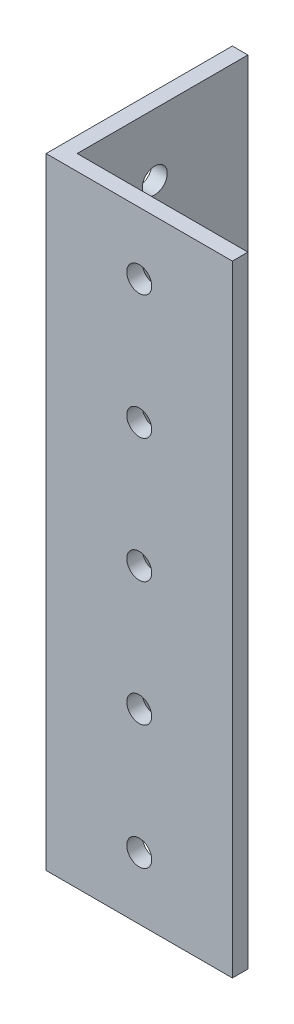
ISO-10303-21;
HEADER;
FILE_DESCRIPTION(('STEP AP214'),'2;1');
FILE_NAME('part.step','',(''),(''),'','','');
FILE_SCHEMA(('AUTOMOTIVE_DESIGN { 1 0 10303 214 1 1 1 1 }'));
ENDSEC;
DATA;
#1=APPLICATION_CONTEXT('core data for automotive mechanical design processes');
#2=APPLICATION_PROTOCOL_DEFINITION('international standard','automotive_design',2000,#1);
#3=PRODUCT_CONTEXT('',#1,'mechanical');
#4=PRODUCT('Part','Part','',(#3));
#5=PRODUCT_RELATED_PRODUCT_CATEGORY('part','',(#4));
#6=PRODUCT_DEFINITION_FORMATION('','',#4);
#7=PRODUCT_DEFINITION_CONTEXT('part definition',#1,'design');
#8=PRODUCT_DEFINITION('design','',#6,#7);
#9=PRODUCT_DEFINITION_SHAPE('','',#8);
#10=(LENGTH_UNIT() NAMED_UNIT(*) SI_UNIT(.MILLI.,.METRE.));
#11=(NAMED_UNIT(*) PLANE_ANGLE_UNIT() SI_UNIT($,.RADIAN.));
#12=(NAMED_UNIT(*) SI_UNIT($,.STERADIAN.) SOLID_ANGLE_UNIT());
#13=UNCERTAINTY_MEASURE_WITH_UNIT(LENGTH_MEASURE(1.E-05),#10,'distance_accuracy_value','');
#14=(GEOMETRIC_REPRESENTATION_CONTEXT(3) GLOBAL_UNCERTAINTY_ASSIGNED_CONTEXT((#13)) GLOBAL_UNIT_ASSIGNED_CONTEXT((#10,
#11,#12)) REPRESENTATION_CONTEXT('',''));
#15=CARTESIAN_POINT('',(0.,0.,0.));
#16=DIRECTION('',(0.,0.,1.));
#17=DIRECTION('',(1.,0.,0.));
#18=AXIS2_PLACEMENT_3D('',#15,#16,#17);
#19=CARTESIAN_POINT('',(0.,127.,-2.67982574257426));
#20=DIRECTION('',(0.,0.,-1.));
#21=DIRECTION('',(-1.,0.,0.));
#22=AXIS2_PLACEMENT_3D('',#19,#20,#21);
#23=PLANE('',#22);
#24=CARTESIAN_POINT('',(-14.2697702970297,114.3,-2.67982574257426));
#25=DIRECTION('',(0.,0.,-1.));
#26=DIRECTION('',(-1.,0.,0.));
#27=AXIS2_PLACEMENT_3D('',#24,#25,#26);
#28=CIRCLE('',#27,2.5527);
#29=CARTESIAN_POINT('',(-16.8224702970297,114.3,-2.67982574257426));
#30=VERTEX_POINT('',#29);
#31=EDGE_CURVE('E205',#30,#30,#28,.T.);
#32=ORIENTED_EDGE('',*,*,#31,.F.);
#33=EDGE_LOOP('',(#32));
#34=FACE_BOUND('',#33,.T.);
#35=CARTESIAN_POINT('',(-14.2697702970297,88.9,-2.67982574257426));
#36=DIRECTION('',(0.,0.,-1.));
#37=DIRECTION('',(-1.,0.,0.));
#38=AXIS2_PLACEMENT_3D('',#35,#36,#37);
#39=CIRCLE('',#38,2.5527);
#40=CARTESIAN_POINT('',(-16.8224702970297,88.9,-2.67982574257426));
#41=VERTEX_POINT('',#40);
#42=EDGE_CURVE('E199',#41,#41,#39,.T.);
#43=ORIENTED_EDGE('',*,*,#42,.F.);
#44=EDGE_LOOP('',(#43));
#45=FACE_BOUND('',#44,.T.);
#46=CARTESIAN_POINT('',(-14.2697702970297,63.5,-2.67982574257426));
#47=DIRECTION('',(0.,0.,-1.));
#48=DIRECTION('',(-1.,0.,0.));
#49=AXIS2_PLACEMENT_3D('',#46,#47,#48);
#50=CIRCLE('',#49,2.5527);
#51=CARTESIAN_POINT('',(-16.8224702970297,63.5,-2.67982574257426));
#52=VERTEX_POINT('',#51);
#53=EDGE_CURVE('E193',#52,#52,#50,.T.);
#54=ORIENTED_EDGE('',*,*,#53,.F.);
#55=EDGE_LOOP('',(#54));
#56=FACE_BOUND('',#55,.T.);
#57=CARTESIAN_POINT('',(-14.2697702970297,38.1,-2.67982574257426));
#58=DIRECTION('',(0.,0.,-1.));
#59=DIRECTION('',(-1.,0.,0.));
#60=AXIS2_PLACEMENT_3D('',#57,#58,#59);
#61=CIRCLE('',#60,2.5527);
#62=CARTESIAN_POINT('',(-16.8224702970297,38.1,-2.67982574257426));
#63=VERTEX_POINT('',#62);
#64=EDGE_CURVE('E185',#63,#63,#61,.T.);
#65=ORIENTED_EDGE('',*,*,#64,.F.);
#66=EDGE_LOOP('',(#65));
#67=FACE_BOUND('',#66,.T.);
#68=CARTESIAN_POINT('',(-14.2697702970297,12.7,-2.67982574257426));
#69=DIRECTION('',(0.,0.,-1.));
#70=DIRECTION('',(-1.,0.,0.));
#71=AXIS2_PLACEMENT_3D('',#68,#69,#70);
#72=CIRCLE('',#71,2.5527);
#73=CARTESIAN_POINT('',(-16.8224702970297,12.7,-2.67982574257426));
#74=VERTEX_POINT('',#73);
#75=EDGE_CURVE('E182',#74,#74,#72,.T.);
#76=ORIENTED_EDGE('',*,*,#75,.F.);
#77=EDGE_LOOP('',(#76));
#78=FACE_BOUND('',#77,.T.);
#79=DIRECTION('',(1.,0.,0.));
#80=VECTOR('',#79,1.);
#81=CARTESIAN_POINT('',(0.,0.,-2.67982574257426));
#82=LINE('',#81,#80);
#83=CARTESIAN_POINT('',(-30.1447702970297,0.,-2.67982574257426));
#84=VERTEX_POINT('',#83);
#85=CARTESIAN_POINT('',(4.7802297029703,0.,-2.67982574257426));
#86=VERTEX_POINT('',#85);
#87=EDGE_CURVE('E121',#84,#86,#82,.T.);
#88=ORIENTED_EDGE('',*,*,#87,.F.);
#89=DIRECTION('',(0.,-1.,0.));
#90=VECTOR('',#89,1.);
#91=CARTESIAN_POINT('',(-30.1447702970297,127.,-2.67982574257426));
#92=LINE('',#91,#90);
#93=CARTESIAN_POINT('',(-30.1447702970297,127.,-2.67982574257426));
#94=VERTEX_POINT('',#93);
#95=EDGE_CURVE('E11',#94,#84,#92,.T.);
#96=ORIENTED_EDGE('',*,*,#95,.F.);
#97=DIRECTION('',(1.,0.,0.));
#98=VECTOR('',#97,1.);
#99=CARTESIAN_POINT('',(0.,127.,-2.67982574257426));
#100=LINE('',#99,#98);
#101=CARTESIAN_POINT('',(4.7802297029703,127.,-2.67982574257426));
#102=VERTEX_POINT('',#101);
#103=EDGE_CURVE('E135',#94,#102,#100,.T.);
#104=ORIENTED_EDGE('',*,*,#103,.T.);
#105=DIRECTION('',(0.,-1.,0.));
#106=VECTOR('',#105,1.);
#107=CARTESIAN_POINT('',(4.7802297029703,127.,-2.67982574257426));
#108=LINE('',#107,#106);
#109=EDGE_CURVE('E83',#102,#86,#108,.T.);
#110=ORIENTED_EDGE('',*,*,#109,.T.);
#111=EDGE_LOOP('',(#88,#96,#104,#110));
#112=FACE_BOUND('',#111,.T.);
#113=ADVANCED_FACE('F39',(#34,#45,#56,#67,#78,#112),#23,.T.);
#114=CARTESIAN_POINT('',(-30.1447702970297,127.,0.));
#115=DIRECTION('',(-1.,0.,0.));
#116=DIRECTION('',(0.,0.,1.));
#117=AXIS2_PLACEMENT_3D('',#114,#115,#116);
#118=PLANE('',#117);
#119=CARTESIAN_POINT('',(-30.1447702970297,114.3,-18.5548257425743));
#120=DIRECTION('',(1.,0.,0.));
#121=DIRECTION('',(0.,0.,-1.));
#122=AXIS2_PLACEMENT_3D('',#119,#120,#121);
#123=CIRCLE('',#122,2.5527);
#124=CARTESIAN_POINT('',(-30.1447702970297,114.3,-21.1075257425743));
#125=VERTEX_POINT('',#124);
#126=EDGE_CURVE('E175',#125,#125,#123,.T.);
#127=ORIENTED_EDGE('',*,*,#126,.F.);
#128=EDGE_LOOP('',(#127));
#129=FACE_BOUND('',#128,.T.);
#130=CARTESIAN_POINT('',(-30.1447702970297,88.9,-18.5548257425743));
#131=DIRECTION('',(1.,0.,0.));
#132=DIRECTION('',(0.,0.,-1.));
#133=AXIS2_PLACEMENT_3D('',#130,#131,#132);
#134=CIRCLE('',#133,2.5527);
#135=CARTESIAN_POINT('',(-30.1447702970297,88.9,-21.1075257425743));
#136=VERTEX_POINT('',#135);
#137=EDGE_CURVE('E169',#136,#136,#134,.T.);
#138=ORIENTED_EDGE('',*,*,#137,.F.);
#139=EDGE_LOOP('',(#138));
#140=FACE_BOUND('',#139,.T.);
#141=CARTESIAN_POINT('',(-30.1447702970297,63.5,-18.5548257425743));
#142=DIRECTION('',(1.,0.,0.));
#143=DIRECTION('',(0.,0.,-1.));
#144=AXIS2_PLACEMENT_3D('',#141,#142,#143);
#145=CIRCLE('',#144,2.5527);
#146=CARTESIAN_POINT('',(-30.1447702970297,63.5,-21.1075257425743));
#147=VERTEX_POINT('',#146);
#148=EDGE_CURVE('E163',#147,#147,#145,.T.);
#149=ORIENTED_EDGE('',*,*,#148,.F.);
#150=EDGE_LOOP('',(#149));
#151=FACE_BOUND('',#150,.T.);
#152=CARTESIAN_POINT('',(-30.1447702970297,38.1,-18.5548257425743));
#153=DIRECTION('',(1.,0.,0.));
#154=DIRECTION('',(0.,0.,-1.));
#155=AXIS2_PLACEMENT_3D('',#152,#153,#154);
#156=CIRCLE('',#155,2.5527);
#157=CARTESIAN_POINT('',(-30.1447702970297,38.1,-21.1075257425743));
#158=VERTEX_POINT('',#157);
#159=EDGE_CURVE('E155',#158,#158,#156,.T.);
#160=ORIENTED_EDGE('',*,*,#159,.F.);
#161=EDGE_LOOP('',(#160));
#162=FACE_BOUND('',#161,.T.);
#163=CARTESIAN_POINT('',(-30.1447702970297,12.7,-18.5548257425743));
#164=DIRECTION('',(1.,0.,0.));
#165=DIRECTION('',(0.,0.,-1.));
#166=AXIS2_PLACEMENT_3D('',#163,#164,#165);
#167=CIRCLE('',#166,2.5527);
#168=CARTESIAN_POINT('',(-30.1447702970297,12.7,-21.1075257425743));
#169=VERTEX_POINT('',#168);
#170=EDGE_CURVE('E152',#169,#169,#167,.T.);
#171=ORIENTED_EDGE('',*,*,#170,.F.);
#172=EDGE_LOOP('',(#171));
#173=FACE_BOUND('',#172,.T.);
#174=DIRECTION('',(0.,0.,-1.));
#175=VECTOR('',#174,1.);
#176=CARTESIAN_POINT('',(-30.1447702970297,0.,0.));
#177=LINE('',#176,#175);
#178=CARTESIAN_POINT('',(-30.1447702970297,0.,-37.6048257425743));
#179=VERTEX_POINT('',#178);
#180=EDGE_CURVE('E124',#84,#179,#177,.T.);
#181=ORIENTED_EDGE('',*,*,#180,.T.);
#182=DIRECTION('',(0.,-1.,0.));
#183=VECTOR('',#182,1.);
#184=CARTESIAN_POINT('',(-30.1447702970297,127.,-37.6048257425743));
#185=LINE('',#184,#183);
#186=CARTESIAN_POINT('',(-30.1447702970297,127.,-37.6048257425743));
#187=VERTEX_POINT('',#186);
#188=EDGE_CURVE('E47',#187,#179,#185,.T.);
#189=ORIENTED_EDGE('',*,*,#188,.F.);
#190=DIRECTION('',(0.,0.,-1.));
#191=VECTOR('',#190,1.);
#192=CARTESIAN_POINT('',(-30.1447702970297,127.,0.));
#193=LINE('',#192,#191);
#194=EDGE_CURVE('E116',#94,#187,#193,.T.);
#195=ORIENTED_EDGE('',*,*,#194,.F.);
#196=ORIENTED_EDGE('',*,*,#95,.T.);
#197=EDGE_LOOP('',(#181,#189,#195,#196));
#198=FACE_BOUND('',#197,.T.);
#199=ADVANCED_FACE('F144',(#129,#140,#151,#162,#173,#198),#118,.F.);
#200=CARTESIAN_POINT('',(0.,127.,-37.6048257425743));
#201=DIRECTION('',(0.,0.,-1.));
#202=DIRECTION('',(-1.,0.,0.));
#203=AXIS2_PLACEMENT_3D('',#200,#201,#202);
#204=PLANE('',#203);
#205=DIRECTION('',(1.,0.,0.));
#206=VECTOR('',#205,1.);
#207=CARTESIAN_POINT('',(0.,0.,-37.6048257425743));
#208=LINE('',#207,#206);
#209=CARTESIAN_POINT('',(-33.3197702970297,0.,-37.6048257425743));
#210=VERTEX_POINT('',#209);
#211=EDGE_CURVE('E128',#210,#179,#208,.T.);
#212=ORIENTED_EDGE('',*,*,#211,.F.);
#213=DIRECTION('',(0.,-1.,0.));
#214=VECTOR('',#213,1.);
#215=CARTESIAN_POINT('',(-33.3197702970297,127.,-37.6048257425743));
#216=LINE('',#215,#214);
#217=CARTESIAN_POINT('',(-33.3197702970297,127.,-37.6048257425743));
#218=VERTEX_POINT('',#217);
#219=EDGE_CURVE('E105',#218,#210,#216,.T.);
#220=ORIENTED_EDGE('',*,*,#219,.F.);
#221=DIRECTION('',(1.,0.,0.));
#222=VECTOR('',#221,1.);
#223=CARTESIAN_POINT('',(0.,127.,-37.6048257425743));
#224=LINE('',#223,#222);
#225=EDGE_CURVE('E114',#218,#187,#224,.T.);
#226=ORIENTED_EDGE('',*,*,#225,.T.);
#227=ORIENTED_EDGE('',*,*,#188,.T.);
#228=EDGE_LOOP('',(#212,#220,#226,#227));
#229=FACE_BOUND('',#228,.T.);
#230=ADVANCED_FACE('F141',(#229),#204,.T.);
#231=CARTESIAN_POINT('',(-33.3197702970297,127.,0.));
#232=DIRECTION('',(-1.,0.,0.));
#233=DIRECTION('',(0.,0.,1.));
#234=AXIS2_PLACEMENT_3D('',#231,#232,#233);
#235=PLANE('',#234);
#236=CARTESIAN_POINT('',(-33.3197702970297,114.3,-18.5548257425743));
#237=DIRECTION('',(1.,0.,0.));
#238=DIRECTION('',(0.,0.,-1.));
#239=AXIS2_PLACEMENT_3D('',#236,#237,#238);
#240=CIRCLE('',#239,2.5527);
#241=CARTESIAN_POINT('',(-33.3197702970297,114.3,-21.1075257425743));
#242=VERTEX_POINT('',#241);
#243=EDGE_CURVE('E178',#242,#242,#240,.T.);
#244=ORIENTED_EDGE('',*,*,#243,.T.);
#245=EDGE_LOOP('',(#244));
#246=FACE_BOUND('',#245,.T.);
#247=CARTESIAN_POINT('',(-33.3197702970297,88.9,-18.5548257425743));
#248=DIRECTION('',(1.,0.,0.));
#249=DIRECTION('',(0.,0.,-1.));
#250=AXIS2_PLACEMENT_3D('',#247,#248,#249);
#251=CIRCLE('',#250,2.5527);
#252=CARTESIAN_POINT('',(-33.3197702970297,88.9,-21.1075257425743));
#253=VERTEX_POINT('',#252);
#254=EDGE_CURVE('E172',#253,#253,#251,.T.);
#255=ORIENTED_EDGE('',*,*,#254,.T.);
#256=EDGE_LOOP('',(#255));
#257=FACE_BOUND('',#256,.T.);
#258=CARTESIAN_POINT('',(-33.3197702970297,63.5,-18.5548257425743));
#259=DIRECTION('',(1.,0.,0.));
#260=DIRECTION('',(0.,0.,-1.));
#261=AXIS2_PLACEMENT_3D('',#258,#259,#260);
#262=CIRCLE('',#261,2.5527);
#263=CARTESIAN_POINT('',(-33.3197702970297,63.5,-21.1075257425743));
#264=VERTEX_POINT('',#263);
#265=EDGE_CURVE('E166',#264,#264,#262,.T.);
#266=ORIENTED_EDGE('',*,*,#265,.T.);
#267=EDGE_LOOP('',(#266));
#268=FACE_BOUND('',#267,.T.);
#269=CARTESIAN_POINT('',(-33.3197702970297,38.1,-18.5548257425743));
#270=DIRECTION('',(1.,0.,0.));
#271=DIRECTION('',(0.,0.,-1.));
#272=AXIS2_PLACEMENT_3D('',#269,#270,#271);
#273=CIRCLE('',#272,2.5527);
#274=CARTESIAN_POINT('',(-33.3197702970297,38.1,-21.1075257425743));
#275=VERTEX_POINT('',#274);
#276=EDGE_CURVE('E160',#275,#275,#273,.T.);
#277=ORIENTED_EDGE('',*,*,#276,.T.);
#278=EDGE_LOOP('',(#277));
#279=FACE_BOUND('',#278,.T.);
#280=CARTESIAN_POINT('',(-33.3197702970297,12.7,-18.5548257425743));
#281=DIRECTION('',(1.,0.,0.));
#282=DIRECTION('',(0.,0.,-1.));
#283=AXIS2_PLACEMENT_3D('',#280,#281,#282);
#284=CIRCLE('',#283,2.5527);
#285=CARTESIAN_POINT('',(-33.3197702970297,12.7,-21.1075257425743));
#286=VERTEX_POINT('',#285);
#287=EDGE_CURVE('E125',#286,#286,#284,.T.);
#288=ORIENTED_EDGE('',*,*,#287,.T.);
#289=EDGE_LOOP('',(#288));
#290=FACE_BOUND('',#289,.T.);
#291=DIRECTION('',(0.,0.,-1.));
#292=VECTOR('',#291,1.);
#293=CARTESIAN_POINT('',(-33.3197702970297,0.,0.));
#294=LINE('',#293,#292);
#295=CARTESIAN_POINT('',(-33.3197702970297,0.,0.495174257425744));
#296=VERTEX_POINT('',#295);
#297=EDGE_CURVE('E104',#296,#210,#294,.T.);
#298=ORIENTED_EDGE('',*,*,#297,.F.);
#299=DIRECTION('',(0.,-1.,0.));
#300=VECTOR('',#299,1.);
#301=CARTESIAN_POINT('',(-33.3197702970297,127.,0.495174257425744));
#302=LINE('',#301,#300);
#303=CARTESIAN_POINT('',(-33.3197702970297,127.,0.495174257425744));
#304=VERTEX_POINT('',#303);
#305=EDGE_CURVE('E98',#304,#296,#302,.T.);
#306=ORIENTED_EDGE('',*,*,#305,.F.);
#307=DIRECTION('',(0.,0.,-1.));
#308=VECTOR('',#307,1.);
#309=CARTESIAN_POINT('',(-33.3197702970297,127.,0.));
#310=LINE('',#309,#308);
#311=EDGE_CURVE('E102',#304,#218,#310,.T.);
#312=ORIENTED_EDGE('',*,*,#311,.T.);
#313=ORIENTED_EDGE('',*,*,#219,.T.);
#314=EDGE_LOOP('',(#298,#306,#312,#313));
#315=FACE_BOUND('',#314,.T.);
#316=ADVANCED_FACE('F100',(#246,#257,#268,#279,#290,#315),#235,.T.);
#317=CARTESIAN_POINT('',(0.,127.,0.495174257425744));
#318=DIRECTION('',(0.,0.,-1.));
#319=DIRECTION('',(-1.,0.,0.));
#320=AXIS2_PLACEMENT_3D('',#317,#318,#319);
#321=PLANE('',#320);
#322=CARTESIAN_POINT('',(-14.2697702970297,114.3,0.495174257425744));
#323=DIRECTION('',(0.,0.,-1.));
#324=DIRECTION('',(-1.,0.,0.));
#325=AXIS2_PLACEMENT_3D('',#322,#323,#324);
#326=CIRCLE('',#325,2.5527);
#327=CARTESIAN_POINT('',(-16.8224702970297,114.3,0.495174257425744));
#328=VERTEX_POINT('',#327);
#329=EDGE_CURVE('E208',#328,#328,#326,.T.);
#330=ORIENTED_EDGE('',*,*,#329,.T.);
#331=EDGE_LOOP('',(#330));
#332=FACE_BOUND('',#331,.T.);
#333=CARTESIAN_POINT('',(-14.2697702970297,88.9,0.495174257425744));
#334=DIRECTION('',(0.,0.,-1.));
#335=DIRECTION('',(-1.,0.,0.));
#336=AXIS2_PLACEMENT_3D('',#333,#334,#335);
#337=CIRCLE('',#336,2.5527);
#338=CARTESIAN_POINT('',(-16.8224702970297,88.9,0.495174257425744));
#339=VERTEX_POINT('',#338);
#340=EDGE_CURVE('E202',#339,#339,#337,.T.);
#341=ORIENTED_EDGE('',*,*,#340,.T.);
#342=EDGE_LOOP('',(#341));
#343=FACE_BOUND('',#342,.T.);
#344=CARTESIAN_POINT('',(-14.2697702970297,63.5,0.495174257425744));
#345=DIRECTION('',(0.,0.,-1.));
#346=DIRECTION('',(-1.,0.,0.));
#347=AXIS2_PLACEMENT_3D('',#344,#345,#346);
#348=CIRCLE('',#347,2.5527);
#349=CARTESIAN_POINT('',(-16.8224702970297,63.5,0.495174257425744));
#350=VERTEX_POINT('',#349);
#351=EDGE_CURVE('E196',#350,#350,#348,.T.);
#352=ORIENTED_EDGE('',*,*,#351,.T.);
#353=EDGE_LOOP('',(#352));
#354=FACE_BOUND('',#353,.T.);
#355=CARTESIAN_POINT('',(-14.2697702970297,38.1,0.495174257425744));
#356=DIRECTION('',(0.,0.,-1.));
#357=DIRECTION('',(-1.,0.,0.));
#358=AXIS2_PLACEMENT_3D('',#355,#356,#357);
#359=CIRCLE('',#358,2.5527);
#360=CARTESIAN_POINT('',(-16.8224702970297,38.1,0.495174257425744));
#361=VERTEX_POINT('',#360);
#362=EDGE_CURVE('E190',#361,#361,#359,.T.);
#363=ORIENTED_EDGE('',*,*,#362,.T.);
#364=EDGE_LOOP('',(#363));
#365=FACE_BOUND('',#364,.T.);
#366=CARTESIAN_POINT('',(-14.2697702970297,12.7,0.495174257425744));
#367=DIRECTION('',(0.,0.,-1.));
#368=DIRECTION('',(-1.,0.,0.));
#369=AXIS2_PLACEMENT_3D('',#366,#367,#368);
#370=CIRCLE('',#369,2.5527);
#371=CARTESIAN_POINT('',(-16.8224702970297,12.7,0.495174257425744));
#372=VERTEX_POINT('',#371);
#373=EDGE_CURVE('E181',#372,#372,#370,.T.);
#374=ORIENTED_EDGE('',*,*,#373,.T.);
#375=EDGE_LOOP('',(#374));
#376=FACE_BOUND('',#375,.T.);
#377=DIRECTION('',(1.,0.,0.));
#378=VECTOR('',#377,1.);
#379=CARTESIAN_POINT('',(0.,0.,0.495174257425744));
#380=LINE('',#379,#378);
#381=CARTESIAN_POINT('',(4.7802297029703,0.,0.495174257425744));
#382=VERTEX_POINT('',#381);
#383=EDGE_CURVE('E76',#296,#382,#380,.T.);
#384=ORIENTED_EDGE('',*,*,#383,.T.);
#385=DIRECTION('',(0.,-1.,0.));
#386=VECTOR('',#385,1.);
#387=CARTESIAN_POINT('',(4.7802297029703,127.,0.495174257425744));
#388=LINE('',#387,#386);
#389=CARTESIAN_POINT('',(4.7802297029703,127.,0.495174257425744));
#390=VERTEX_POINT('',#389);
#391=EDGE_CURVE('E106',#390,#382,#388,.T.);
#392=ORIENTED_EDGE('',*,*,#391,.F.);
#393=DIRECTION('',(1.,0.,0.));
#394=VECTOR('',#393,1.);
#395=CARTESIAN_POINT('',(0.,127.,0.495174257425744));
#396=LINE('',#395,#394);
#397=EDGE_CURVE('E108',#304,#390,#396,.T.);
#398=ORIENTED_EDGE('',*,*,#397,.F.);
#399=ORIENTED_EDGE('',*,*,#305,.T.);
#400=EDGE_LOOP('',(#384,#392,#398,#399));
#401=FACE_BOUND('',#400,.T.);
#402=ADVANCED_FACE('F109',(#332,#343,#354,#365,#376,#401),#321,.F.);
#403=CARTESIAN_POINT('',(4.7802297029703,127.,0.));
#404=DIRECTION('',(-1.,0.,0.));
#405=DIRECTION('',(0.,0.,1.));
#406=AXIS2_PLACEMENT_3D('',#403,#404,#405);
#407=PLANE('',#406);
#408=DIRECTION('',(0.,0.,-1.));
#409=VECTOR('',#408,1.);
#410=CARTESIAN_POINT('',(4.7802297029703,0.,0.));
#411=LINE('',#410,#409);
#412=EDGE_CURVE('E133',#382,#86,#411,.T.);
#413=ORIENTED_EDGE('',*,*,#412,.T.);
#414=ORIENTED_EDGE('',*,*,#109,.F.);
#415=DIRECTION('',(0.,0.,-1.));
#416=VECTOR('',#415,1.);
#417=CARTESIAN_POINT('',(4.7802297029703,127.,0.));
#418=LINE('',#417,#416);
#419=EDGE_CURVE('E55',#390,#102,#418,.T.);
#420=ORIENTED_EDGE('',*,*,#419,.F.);
#421=ORIENTED_EDGE('',*,*,#391,.T.);
#422=EDGE_LOOP('',(#413,#414,#420,#421));
#423=FACE_BOUND('',#422,.T.);
#424=ADVANCED_FACE('F149',(#423),#407,.F.);
#425=CARTESIAN_POINT('',(0.,127.,0.));
#426=DIRECTION('',(0.,1.,0.));
#427=DIRECTION('',(0.,0.,1.));
#428=AXIS2_PLACEMENT_3D('',#425,#426,#427);
#429=PLANE('',#428);
#430=ORIENTED_EDGE('',*,*,#103,.F.);
#431=ORIENTED_EDGE('',*,*,#194,.T.);
#432=ORIENTED_EDGE('',*,*,#225,.F.);
#433=ORIENTED_EDGE('',*,*,#311,.F.);
#434=ORIENTED_EDGE('',*,*,#397,.T.);
#435=ORIENTED_EDGE('',*,*,#419,.T.);
#436=EDGE_LOOP('',(#430,#431,#432,#433,#434,#435));
#437=FACE_BOUND('',#436,.T.);
#438=ADVANCED_FACE('F112',(#437),#429,.T.);
#439=CARTESIAN_POINT('',(0.,0.,0.));
#440=DIRECTION('',(0.,1.,0.));
#441=DIRECTION('',(0.,0.,1.));
#442=AXIS2_PLACEMENT_3D('',#439,#440,#441);
#443=PLANE('',#442);
#444=ORIENTED_EDGE('',*,*,#87,.T.);
#445=ORIENTED_EDGE('',*,*,#412,.F.);
#446=ORIENTED_EDGE('',*,*,#383,.F.);
#447=ORIENTED_EDGE('',*,*,#297,.T.);
#448=ORIENTED_EDGE('',*,*,#211,.T.);
#449=ORIENTED_EDGE('',*,*,#180,.F.);
#450=EDGE_LOOP('',(#444,#445,#446,#447,#448,#449));
#451=FACE_BOUND('',#450,.T.);
#452=ADVANCED_FACE('F146',(#451),#443,.F.);
#453=CARTESIAN_POINT('',(-33.3197702970297,12.7,-18.5548257425743));
#454=DIRECTION('',(1.,0.,0.));
#455=DIRECTION('',(0.,0.,-1.));
#456=AXIS2_PLACEMENT_3D('',#453,#454,#455);
#457=CYLINDRICAL_SURFACE('',#456,2.5527);
#458=ORIENTED_EDGE('',*,*,#287,.F.);
#459=EDGE_LOOP('',(#458));
#460=FACE_BOUND('',#459,.T.);
#461=ORIENTED_EDGE('',*,*,#170,.T.);
#462=EDGE_LOOP('',(#461));
#463=FACE_BOUND('',#462,.T.);
#464=ADVANCED_FACE('F260',(#460,#463),#457,.F.);
#465=CARTESIAN_POINT('',(-33.3197702970297,38.1,-18.5548257425743));
#466=DIRECTION('',(1.,0.,0.));
#467=DIRECTION('',(0.,0.,-1.));
#468=AXIS2_PLACEMENT_3D('',#465,#466,#467);
#469=CYLINDRICAL_SURFACE('',#468,2.5527);
#470=ORIENTED_EDGE('',*,*,#276,.F.);
#471=EDGE_LOOP('',(#470));
#472=FACE_BOUND('',#471,.T.);
#473=ORIENTED_EDGE('',*,*,#159,.T.);
#474=EDGE_LOOP('',(#473));
#475=FACE_BOUND('',#474,.T.);
#476=ADVANCED_FACE('F256',(#472,#475),#469,.F.);
#477=CARTESIAN_POINT('',(-33.3197702970297,63.5,-18.5548257425743));
#478=DIRECTION('',(1.,0.,0.));
#479=DIRECTION('',(0.,0.,-1.));
#480=AXIS2_PLACEMENT_3D('',#477,#478,#479);
#481=CYLINDRICAL_SURFACE('',#480,2.5527);
#482=ORIENTED_EDGE('',*,*,#265,.F.);
#483=EDGE_LOOP('',(#482));
#484=FACE_BOUND('',#483,.T.);
#485=ORIENTED_EDGE('',*,*,#148,.T.);
#486=EDGE_LOOP('',(#485));
#487=FACE_BOUND('',#486,.T.);
#488=ADVANCED_FACE('F252',(#484,#487),#481,.F.);
#489=CARTESIAN_POINT('',(-33.3197702970297,88.9,-18.5548257425743));
#490=DIRECTION('',(1.,0.,0.));
#491=DIRECTION('',(0.,0.,-1.));
#492=AXIS2_PLACEMENT_3D('',#489,#490,#491);
#493=CYLINDRICAL_SURFACE('',#492,2.5527);
#494=ORIENTED_EDGE('',*,*,#254,.F.);
#495=EDGE_LOOP('',(#494));
#496=FACE_BOUND('',#495,.T.);
#497=ORIENTED_EDGE('',*,*,#137,.T.);
#498=EDGE_LOOP('',(#497));
#499=FACE_BOUND('',#498,.T.);
#500=ADVANCED_FACE('F244',(#496,#499),#493,.F.);
#501=CARTESIAN_POINT('',(-33.3197702970297,114.3,-18.5548257425743));
#502=DIRECTION('',(1.,0.,0.));
#503=DIRECTION('',(0.,0.,-1.));
#504=AXIS2_PLACEMENT_3D('',#501,#502,#503);
#505=CYLINDRICAL_SURFACE('',#504,2.5527);
#506=ORIENTED_EDGE('',*,*,#243,.F.);
#507=EDGE_LOOP('',(#506));
#508=FACE_BOUND('',#507,.T.);
#509=ORIENTED_EDGE('',*,*,#126,.T.);
#510=EDGE_LOOP('',(#509));
#511=FACE_BOUND('',#510,.T.);
#512=ADVANCED_FACE('F234',(#508,#511),#505,.F.);
#513=CARTESIAN_POINT('',(-14.2697702970297,12.7,0.495174257425744));
#514=DIRECTION('',(0.,0.,-1.));
#515=DIRECTION('',(-1.,0.,0.));
#516=AXIS2_PLACEMENT_3D('',#513,#514,#515);
#517=CYLINDRICAL_SURFACE('',#516,2.5527);
#518=ORIENTED_EDGE('',*,*,#373,.F.);
#519=EDGE_LOOP('',(#518));
#520=FACE_BOUND('',#519,.T.);
#521=ORIENTED_EDGE('',*,*,#75,.T.);
#522=EDGE_LOOP('',(#521));
#523=FACE_BOUND('',#522,.T.);
#524=ADVANCED_FACE('F231',(#520,#523),#517,.F.);
#525=CARTESIAN_POINT('',(-14.2697702970297,38.1,0.495174257425744));
#526=DIRECTION('',(0.,0.,-1.));
#527=DIRECTION('',(-1.,0.,0.));
#528=AXIS2_PLACEMENT_3D('',#525,#526,#527);
#529=CYLINDRICAL_SURFACE('',#528,2.5527);
#530=ORIENTED_EDGE('',*,*,#362,.F.);
#531=EDGE_LOOP('',(#530));
#532=FACE_BOUND('',#531,.T.);
#533=ORIENTED_EDGE('',*,*,#64,.T.);
#534=EDGE_LOOP('',(#533));
#535=FACE_BOUND('',#534,.T.);
#536=ADVANCED_FACE('F233',(#532,#535),#529,.F.);
#537=CARTESIAN_POINT('',(-14.2697702970297,63.5,0.495174257425744));
#538=DIRECTION('',(0.,0.,-1.));
#539=DIRECTION('',(-1.,0.,0.));
#540=AXIS2_PLACEMENT_3D('',#537,#538,#539);
#541=CYLINDRICAL_SURFACE('',#540,2.5527);
#542=ORIENTED_EDGE('',*,*,#351,.F.);
#543=EDGE_LOOP('',(#542));
#544=FACE_BOUND('',#543,.T.);
#545=ORIENTED_EDGE('',*,*,#53,.T.);
#546=EDGE_LOOP('',(#545));
#547=FACE_BOUND('',#546,.T.);
#548=ADVANCED_FACE('F241',(#544,#547),#541,.F.);
#549=CARTESIAN_POINT('',(-14.2697702970297,88.9,0.495174257425744));
#550=DIRECTION('',(0.,0.,-1.));
#551=DIRECTION('',(-1.,0.,0.));
#552=AXIS2_PLACEMENT_3D('',#549,#550,#551);
#553=CYLINDRICAL_SURFACE('',#552,2.5527);
#554=ORIENTED_EDGE('',*,*,#340,.F.);
#555=EDGE_LOOP('',(#554));
#556=FACE_BOUND('',#555,.T.);
#557=ORIENTED_EDGE('',*,*,#42,.T.);
#558=EDGE_LOOP('',(#557));
#559=FACE_BOUND('',#558,.T.);
#560=ADVANCED_FACE('F217',(#556,#559),#553,.F.);
#561=CARTESIAN_POINT('',(-14.2697702970297,114.3,0.495174257425744));
#562=DIRECTION('',(0.,0.,-1.));
#563=DIRECTION('',(-1.,0.,0.));
#564=AXIS2_PLACEMENT_3D('',#561,#562,#563);
#565=CYLINDRICAL_SURFACE('',#564,2.5527);
#566=ORIENTED_EDGE('',*,*,#329,.F.);
#567=EDGE_LOOP('',(#566));
#568=FACE_BOUND('',#567,.T.);
#569=ORIENTED_EDGE('',*,*,#31,.T.);
#570=EDGE_LOOP('',(#569));
#571=FACE_BOUND('',#570,.T.);
#572=ADVANCED_FACE('F214',(#568,#571),#565,.F.);
#573=CLOSED_SHELL('',(#113,#199,#230,#316,#402,#424,#438,#452,#464,#476,#488,#500,#512,#524,
#536,#548,#560,#572));
#574=MANIFOLD_SOLID_BREP('B2',#573);
#575=ADVANCED_BREP_SHAPE_REPRESENTATION('',(#18,#574),#14);
#576=SHAPE_DEFINITION_REPRESENTATION(#9,#575);
ENDSEC;
END-ISO-10303-21;
